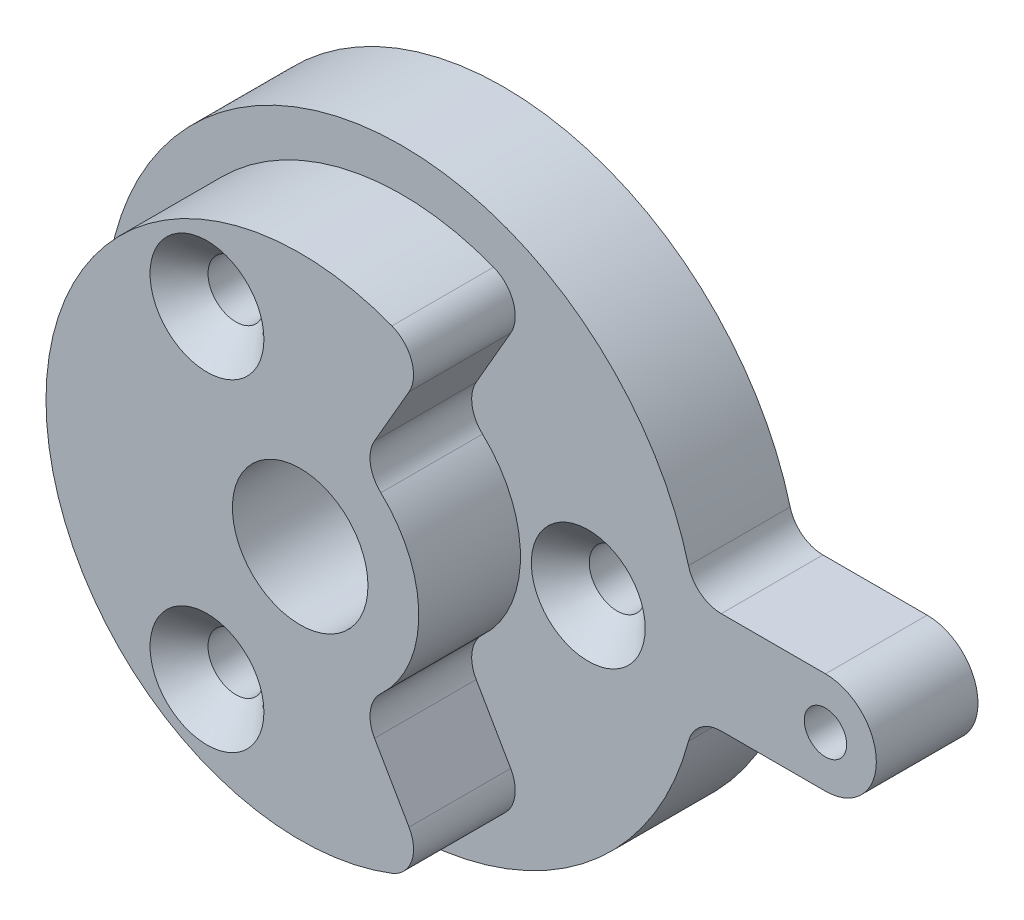
ISO-10303-21;
HEADER;
FILE_DESCRIPTION(('STEP AP214'),'2;1');
FILE_NAME('part.step','',(''),(''),'','','');
FILE_SCHEMA(('AUTOMOTIVE_DESIGN { 1 0 10303 214 1 1 1 1 }'));
ENDSEC;
DATA;
#1=APPLICATION_CONTEXT('core data for automotive mechanical design processes');
#2=APPLICATION_PROTOCOL_DEFINITION('international standard','automotive_design',2000,#1);
#3=PRODUCT_CONTEXT('',#1,'mechanical');
#4=PRODUCT('Part','Part','',(#3));
#5=PRODUCT_RELATED_PRODUCT_CATEGORY('part','',(#4));
#6=PRODUCT_DEFINITION_FORMATION('','',#4);
#7=PRODUCT_DEFINITION_CONTEXT('part definition',#1,'design');
#8=PRODUCT_DEFINITION('design','',#6,#7);
#9=PRODUCT_DEFINITION_SHAPE('','',#8);
#10=(LENGTH_UNIT() NAMED_UNIT(*) SI_UNIT(.MILLI.,.METRE.));
#11=(NAMED_UNIT(*) PLANE_ANGLE_UNIT() SI_UNIT($,.RADIAN.));
#12=(NAMED_UNIT(*) SI_UNIT($,.STERADIAN.) SOLID_ANGLE_UNIT());
#13=UNCERTAINTY_MEASURE_WITH_UNIT(LENGTH_MEASURE(1.E-05),#10,'distance_accuracy_value','');
#14=(GEOMETRIC_REPRESENTATION_CONTEXT(3) GLOBAL_UNCERTAINTY_ASSIGNED_CONTEXT((#13)) GLOBAL_UNIT_ASSIGNED_CONTEXT((#10,
#11,#12)) REPRESENTATION_CONTEXT('',''));
#15=CARTESIAN_POINT('',(0.,0.,0.));
#16=DIRECTION('',(0.,0.,1.));
#17=DIRECTION('',(1.,0.,0.));
#18=AXIS2_PLACEMENT_3D('',#15,#16,#17);
#19=CARTESIAN_POINT('',(0.,0.,12.));
#20=DIRECTION('',(0.,0.,1.));
#21=DIRECTION('',(1.,0.,0.));
#22=AXIS2_PLACEMENT_3D('',#19,#20,#21);
#23=PLANE('',#22);
#24=CARTESIAN_POINT('',(22.,0.,12.));
#25=DIRECTION('',(0.,0.,1.));
#26=DIRECTION('',(1.,0.,0.));
#27=AXIS2_PLACEMENT_3D('',#24,#25,#26);
#28=CIRCLE('',#27,6.72);
#29=CARTESIAN_POINT('',(28.72,0.,12.));
#30=VERTEX_POINT('',#29);
#31=EDGE_CURVE('E554',#30,#30,#28,.T.);
#32=ORIENTED_EDGE('',*,*,#31,.F.);
#33=EDGE_LOOP('',(#32));
#34=FACE_BOUND('',#33,.T.);
#35=CARTESIAN_POINT('',(50.,0.,12.));
#36=DIRECTION('',(0.,0.,1.));
#37=DIRECTION('',(1.,0.,0.));
#38=AXIS2_PLACEMENT_3D('',#35,#36,#37);
#39=CIRCLE('',#38,2.5);
#40=CARTESIAN_POINT('',(52.5,0.,12.));
#41=VERTEX_POINT('',#40);
#42=EDGE_CURVE('E165',#41,#41,#39,.T.);
#43=ORIENTED_EDGE('',*,*,#42,.F.);
#44=EDGE_LOOP('',(#43));
#45=FACE_BOUND('',#44,.T.);
#46=DIRECTION('',(-1.,0.,0.));
#47=VECTOR('',#46,1.);
#48=CARTESIAN_POINT('',(50.,6.,12.));
#49=LINE('',#48,#47);
#50=CARTESIAN_POINT('',(50.,6.,12.));
#51=VERTEX_POINT('',#50);
#52=CARTESIAN_POINT('',(37.6961536499415,6.,12.));
#53=VERTEX_POINT('',#52);
#54=EDGE_CURVE('E152',#51,#53,#49,.T.);
#55=ORIENTED_EDGE('',*,*,#54,.T.);
#56=CARTESIAN_POINT('',(37.6961536499415,10.,12.));
#57=DIRECTION('',(0.,0.,1.));
#58=DIRECTION('',(1.,0.,0.));
#59=AXIS2_PLACEMENT_3D('',#56,#57,#58);
#60=CIRCLE('',#59,4.);
#61=CARTESIAN_POINT('',(33.8298814807168,8.97435897435897,12.));
#62=VERTEX_POINT('',#61);
#63=EDGE_CURVE('E250',#53,#62,#60,.F.);
#64=ORIENTED_EDGE('',*,*,#63,.T.);
#65=CARTESIAN_POINT('',(0.,0.,12.));
#66=DIRECTION('',(0.,0.,1.));
#67=DIRECTION('',(1.,0.,0.));
#68=AXIS2_PLACEMENT_3D('',#65,#66,#67);
#69=CIRCLE('',#68,35.);
#70=CARTESIAN_POINT('',(33.8298814807168,-8.97435897435898,12.));
#71=VERTEX_POINT('',#70);
#72=EDGE_CURVE('E203',#62,#71,#69,.T.);
#73=ORIENTED_EDGE('',*,*,#72,.T.);
#74=CARTESIAN_POINT('',(37.6961536499415,-10.,12.));
#75=DIRECTION('',(0.,0.,1.));
#76=DIRECTION('',(1.,0.,0.));
#77=AXIS2_PLACEMENT_3D('',#74,#75,#76);
#78=CIRCLE('',#77,4.);
#79=CARTESIAN_POINT('',(37.6961536499415,-6.,12.));
#80=VERTEX_POINT('',#79);
#81=EDGE_CURVE('E244',#71,#80,#78,.F.);
#82=ORIENTED_EDGE('',*,*,#81,.T.);
#83=DIRECTION('',(1.,0.,0.));
#84=VECTOR('',#83,1.);
#85=CARTESIAN_POINT('',(50.,-6.,12.));
#86=LINE('',#85,#84);
#87=CARTESIAN_POINT('',(50.,-6.,12.));
#88=VERTEX_POINT('',#87);
#89=EDGE_CURVE('E149',#80,#88,#86,.T.);
#90=ORIENTED_EDGE('',*,*,#89,.T.);
#91=CARTESIAN_POINT('',(50.,0.,12.));
#92=DIRECTION('',(0.,0.,1.));
#93=DIRECTION('',(1.,0.,0.));
#94=AXIS2_PLACEMENT_3D('',#91,#92,#93);
#95=CIRCLE('',#94,6.);
#96=EDGE_CURVE('E144',#88,#51,#95,.T.);
#97=ORIENTED_EDGE('',*,*,#96,.T.);
#98=EDGE_LOOP('',(#55,#64,#73,#82,#90,#97));
#99=FACE_BOUND('',#98,.T.);
#100=CARTESIAN_POINT('',(0.,0.,12.));
#101=DIRECTION('',(0.,0.,1.));
#102=DIRECTION('',(1.,0.,0.));
#103=AXIS2_PLACEMENT_3D('',#100,#101,#102);
#104=CIRCLE('',#103,14.);
#105=CARTESIAN_POINT('',(9.51927355752325,-10.265643230555,12.));
#106=VERTEX_POINT('',#105);
#107=CARTESIAN_POINT('',(9.51927355752325,10.265643230555,12.));
#108=VERTEX_POINT('',#107);
#109=EDGE_CURVE('E178',#106,#108,#104,.T.);
#110=ORIENTED_EDGE('',*,*,#109,.F.);
#111=CARTESIAN_POINT('',(12.2390660025299,-13.1986841535706,12.));
#112=DIRECTION('',(0.,0.,1.));
#113=DIRECTION('',(1.,0.,0.));
#114=AXIS2_PLACEMENT_3D('',#111,#112,#113);
#115=CIRCLE('',#114,4.);
#116=CARTESIAN_POINT('',(8.77496438739214,-15.1986841535707,12.));
#117=VERTEX_POINT('',#116);
#118=EDGE_CURVE('E224',#106,#117,#115,.T.);
#119=ORIENTED_EDGE('',*,*,#118,.T.);
#120=DIRECTION('',(-0.500000000000001,0.866025403784438,0.));
#121=VECTOR('',#120,1.);
#122=CARTESIAN_POINT('',(7.00000000000002,-12.1243556529821,12.));
#123=LINE('',#122,#121);
#124=CARTESIAN_POINT('',(12.8452325786652,-22.248595461287,12.));
#125=VERTEX_POINT('',#124);
#126=EDGE_CURVE('E182',#125,#117,#123,.T.);
#127=ORIENTED_EDGE('',*,*,#126,.F.);
#128=CARTESIAN_POINT('',(9.3811309635274,-24.248595461287,12.));
#129=DIRECTION('',(0.,0.,1.));
#130=DIRECTION('',(1.,0.,0.));
#131=AXIS2_PLACEMENT_3D('',#128,#129,#130);
#132=CIRCLE('',#131,4.);
#133=CARTESIAN_POINT('',(10.8243818809932,-27.9791486091773,12.));
#134=VERTEX_POINT('',#133);
#135=EDGE_CURVE('E254',#125,#134,#132,.F.);
#136=ORIENTED_EDGE('',*,*,#135,.T.);
#137=CARTESIAN_POINT('',(0.,0.,12.));
#138=DIRECTION('',(0.,0.,1.));
#139=DIRECTION('',(1.,0.,0.));
#140=AXIS2_PLACEMENT_3D('',#137,#138,#139);
#141=CIRCLE('',#140,30.);
#142=CARTESIAN_POINT('',(10.8243818809932,27.9791486091773,12.));
#143=VERTEX_POINT('',#142);
#144=EDGE_CURVE('E195',#143,#134,#141,.T.);
#145=ORIENTED_EDGE('',*,*,#144,.F.);
#146=CARTESIAN_POINT('',(9.3811309635274,24.248595461287,12.));
#147=DIRECTION('',(0.,0.,1.));
#148=DIRECTION('',(1.,0.,0.));
#149=AXIS2_PLACEMENT_3D('',#146,#147,#148);
#150=CIRCLE('',#149,4.);
#151=CARTESIAN_POINT('',(12.8452325786652,22.248595461287,12.));
#152=VERTEX_POINT('',#151);
#153=EDGE_CURVE('E45',#143,#152,#150,.F.);
#154=ORIENTED_EDGE('',*,*,#153,.T.);
#155=DIRECTION('',(0.500000000000001,0.866025403784438,0.));
#156=VECTOR('',#155,1.);
#157=CARTESIAN_POINT('',(15.,25.9807621135331,12.));
#158=LINE('',#157,#156);
#159=CARTESIAN_POINT('',(8.77496438739214,15.1986841535707,12.));
#160=VERTEX_POINT('',#159);
#161=EDGE_CURVE('E193',#160,#152,#158,.T.);
#162=ORIENTED_EDGE('',*,*,#161,.F.);
#163=CARTESIAN_POINT('',(12.2390660025299,13.1986841535706,12.));
#164=DIRECTION('',(0.,0.,1.));
#165=DIRECTION('',(1.,0.,0.));
#166=AXIS2_PLACEMENT_3D('',#163,#164,#165);
#167=CIRCLE('',#166,4.);
#168=EDGE_CURVE('E222',#160,#108,#167,.T.);
#169=ORIENTED_EDGE('',*,*,#168,.T.);
#170=EDGE_LOOP('',(#110,#119,#127,#136,#145,#154,#162,#169));
#171=FACE_BOUND('',#170,.T.);
#172=ADVANCED_FACE('F37',(#34,#45,#99,#171),#23,.T.);
#173=CARTESIAN_POINT('',(0.,0.,0.));
#174=DIRECTION('',(0.,0.,1.));
#175=DIRECTION('',(1.,0.,0.));
#176=AXIS2_PLACEMENT_3D('',#173,#174,#175);
#177=PLANE('',#176);
#178=CARTESIAN_POINT('',(-11.,19.0525588832576,0.));
#179=DIRECTION('',(0.,0.,1.));
#180=DIRECTION('',(1.,0.,0.));
#181=AXIS2_PLACEMENT_3D('',#178,#179,#180);
#182=CIRCLE('',#181,3.3);
#183=CARTESIAN_POINT('',(-7.70000000000003,19.0525588832576,0.));
#184=VERTEX_POINT('',#183);
#185=EDGE_CURVE('E566',#184,#184,#182,.T.);
#186=ORIENTED_EDGE('',*,*,#185,.T.);
#187=EDGE_LOOP('',(#186));
#188=FACE_BOUND('',#187,.T.);
#189=CARTESIAN_POINT('',(-11.,-19.0525588832576,0.));
#190=DIRECTION('',(0.,0.,1.));
#191=DIRECTION('',(1.,0.,0.));
#192=AXIS2_PLACEMENT_3D('',#189,#190,#191);
#193=CIRCLE('',#192,3.3);
#194=CARTESIAN_POINT('',(-7.70000000000002,-19.0525588832576,0.));
#195=VERTEX_POINT('',#194);
#196=EDGE_CURVE('E557',#195,#195,#193,.T.);
#197=ORIENTED_EDGE('',*,*,#196,.T.);
#198=EDGE_LOOP('',(#197));
#199=FACE_BOUND('',#198,.T.);
#200=CARTESIAN_POINT('',(22.,0.,0.));
#201=DIRECTION('',(0.,0.,1.));
#202=DIRECTION('',(1.,0.,0.));
#203=AXIS2_PLACEMENT_3D('',#200,#201,#202);
#204=CIRCLE('',#203,3.29999999999999);
#205=CARTESIAN_POINT('',(25.3,0.,0.));
#206=VERTEX_POINT('',#205);
#207=EDGE_CURVE('E548',#206,#206,#204,.T.);
#208=ORIENTED_EDGE('',*,*,#207,.T.);
#209=EDGE_LOOP('',(#208));
#210=FACE_BOUND('',#209,.T.);
#211=CARTESIAN_POINT('',(50.,0.,0.));
#212=DIRECTION('',(0.,0.,1.));
#213=DIRECTION('',(1.,0.,0.));
#214=AXIS2_PLACEMENT_3D('',#211,#212,#213);
#215=CIRCLE('',#214,2.5);
#216=CARTESIAN_POINT('',(52.5,0.,0.));
#217=VERTEX_POINT('',#216);
#218=EDGE_CURVE('E162',#217,#217,#215,.T.);
#219=ORIENTED_EDGE('',*,*,#218,.T.);
#220=EDGE_LOOP('',(#219));
#221=FACE_BOUND('',#220,.T.);
#222=DIRECTION('',(-1.,0.,0.));
#223=VECTOR('',#222,1.);
#224=CARTESIAN_POINT('',(50.,-6.,0.));
#225=LINE('',#224,#223);
#226=CARTESIAN_POINT('',(50.,-6.,0.));
#227=VERTEX_POINT('',#226);
#228=CARTESIAN_POINT('',(37.6961536499415,-6.,0.));
#229=VERTEX_POINT('',#228);
#230=EDGE_CURVE('E171',#227,#229,#225,.T.);
#231=ORIENTED_EDGE('',*,*,#230,.T.);
#232=CARTESIAN_POINT('',(37.6961536499415,-10.,0.));
#233=DIRECTION('',(0.,0.,1.));
#234=DIRECTION('',(1.,0.,0.));
#235=AXIS2_PLACEMENT_3D('',#232,#233,#234);
#236=CIRCLE('',#235,4.);
#237=CARTESIAN_POINT('',(33.8298814807168,-8.97435897435898,0.));
#238=VERTEX_POINT('',#237);
#239=EDGE_CURVE('E246',#229,#238,#236,.T.);
#240=ORIENTED_EDGE('',*,*,#239,.T.);
#241=CARTESIAN_POINT('',(0.,0.,0.));
#242=DIRECTION('',(0.,0.,1.));
#243=DIRECTION('',(1.,0.,0.));
#244=AXIS2_PLACEMENT_3D('',#241,#242,#243);
#245=CIRCLE('',#244,35.);
#246=CARTESIAN_POINT('',(33.8298814807168,8.97435897435897,0.));
#247=VERTEX_POINT('',#246);
#248=EDGE_CURVE('E202',#247,#238,#245,.T.);
#249=ORIENTED_EDGE('',*,*,#248,.F.);
#250=CARTESIAN_POINT('',(37.6961536499415,10.,0.));
#251=DIRECTION('',(0.,0.,1.));
#252=DIRECTION('',(1.,0.,0.));
#253=AXIS2_PLACEMENT_3D('',#250,#251,#252);
#254=CIRCLE('',#253,4.);
#255=CARTESIAN_POINT('',(37.6961536499415,6.,0.));
#256=VERTEX_POINT('',#255);
#257=EDGE_CURVE('E248',#247,#256,#254,.T.);
#258=ORIENTED_EDGE('',*,*,#257,.T.);
#259=DIRECTION('',(1.,0.,0.));
#260=VECTOR('',#259,1.);
#261=CARTESIAN_POINT('',(50.,6.,0.));
#262=LINE('',#261,#260);
#263=CARTESIAN_POINT('',(50.,6.,0.));
#264=VERTEX_POINT('',#263);
#265=EDGE_CURVE('E173',#256,#264,#262,.T.);
#266=ORIENTED_EDGE('',*,*,#265,.T.);
#267=CARTESIAN_POINT('',(50.,0.,0.));
#268=DIRECTION('',(0.,0.,1.));
#269=DIRECTION('',(1.,0.,0.));
#270=AXIS2_PLACEMENT_3D('',#267,#268,#269);
#271=CIRCLE('',#270,6.);
#272=EDGE_CURVE('E145',#264,#227,#271,.F.);
#273=ORIENTED_EDGE('',*,*,#272,.T.);
#274=EDGE_LOOP('',(#231,#240,#249,#258,#266,#273));
#275=FACE_BOUND('',#274,.T.);
#276=CARTESIAN_POINT('',(0.,0.,0.));
#277=DIRECTION('',(0.,0.,1.));
#278=DIRECTION('',(1.,0.,0.));
#279=AXIS2_PLACEMENT_3D('',#276,#277,#278);
#280=CIRCLE('',#279,8.);
#281=CARTESIAN_POINT('',(8.,0.,0.));
#282=VERTEX_POINT('',#281);
#283=EDGE_CURVE('E190',#282,#282,#280,.T.);
#284=ORIENTED_EDGE('',*,*,#283,.T.);
#285=EDGE_LOOP('',(#284));
#286=FACE_BOUND('',#285,.T.);
#287=ADVANCED_FACE('F298',(#188,#199,#210,#221,#275,#286),#177,.F.);
#288=CARTESIAN_POINT('',(0.,0.,12.));
#289=DIRECTION('',(0.,0.,-1.));
#290=DIRECTION('',(-1.,0.,0.));
#291=AXIS2_PLACEMENT_3D('',#288,#289,#290);
#292=CYLINDRICAL_SURFACE('',#291,35.);
#293=ORIENTED_EDGE('',*,*,#248,.T.);
#294=DIRECTION('',(0.,0.,-1.));
#295=VECTOR('',#294,1.);
#296=CARTESIAN_POINT('',(33.8298814807168,-8.97435897435898,12.));
#297=LINE('',#296,#295);
#298=EDGE_CURVE('E211',#238,#71,#297,.F.);
#299=ORIENTED_EDGE('',*,*,#298,.T.);
#300=ORIENTED_EDGE('',*,*,#72,.F.);
#301=DIRECTION('',(0.,0.,-1.));
#302=VECTOR('',#301,1.);
#303=CARTESIAN_POINT('',(33.8298814807168,8.97435897435897,12.));
#304=LINE('',#303,#302);
#305=EDGE_CURVE('E206',#62,#247,#304,.T.);
#306=ORIENTED_EDGE('',*,*,#305,.T.);
#307=EDGE_LOOP('',(#293,#299,#300,#306));
#308=FACE_BOUND('',#307,.T.);
#309=ADVANCED_FACE('F304',(#308),#292,.T.);
#310=CARTESIAN_POINT('',(0.,0.,12.));
#311=DIRECTION('',(0.,0.,-1.));
#312=DIRECTION('',(-1.,0.,0.));
#313=AXIS2_PLACEMENT_3D('',#310,#311,#312);
#314=CYLINDRICAL_SURFACE('',#313,8.);
#315=ORIENTED_EDGE('',*,*,#283,.F.);
#316=EDGE_LOOP('',(#315));
#317=FACE_BOUND('',#316,.T.);
#318=CARTESIAN_POINT('',(0.,0.,24.));
#319=DIRECTION('',(0.,0.,1.));
#320=DIRECTION('',(1.,0.,0.));
#321=AXIS2_PLACEMENT_3D('',#318,#319,#320);
#322=CIRCLE('',#321,8.);
#323=CARTESIAN_POINT('',(8.,0.,24.));
#324=VERTEX_POINT('',#323);
#325=EDGE_CURVE('E175',#324,#324,#322,.T.);
#326=ORIENTED_EDGE('',*,*,#325,.T.);
#327=EDGE_LOOP('',(#326));
#328=FACE_BOUND('',#327,.T.);
#329=ADVANCED_FACE('F310',(#317,#328),#314,.F.);
#330=CARTESIAN_POINT('',(0.,0.,24.));
#331=DIRECTION('',(0.,0.,1.));
#332=DIRECTION('',(1.,0.,0.));
#333=AXIS2_PLACEMENT_3D('',#330,#331,#332);
#334=PLANE('',#333);
#335=CARTESIAN_POINT('',(-11.,19.0525588832576,24.));
#336=DIRECTION('',(0.,0.,1.));
#337=DIRECTION('',(1.,0.,0.));
#338=AXIS2_PLACEMENT_3D('',#335,#336,#337);
#339=CIRCLE('',#338,6.72);
#340=CARTESIAN_POINT('',(-4.28000000000002,19.0525588832576,24.));
#341=VERTEX_POINT('',#340);
#342=EDGE_CURVE('E572',#341,#341,#339,.T.);
#343=ORIENTED_EDGE('',*,*,#342,.F.);
#344=EDGE_LOOP('',(#343));
#345=FACE_BOUND('',#344,.T.);
#346=CARTESIAN_POINT('',(-11.,-19.0525588832576,24.));
#347=DIRECTION('',(0.,0.,1.));
#348=DIRECTION('',(1.,0.,0.));
#349=AXIS2_PLACEMENT_3D('',#346,#347,#348);
#350=CIRCLE('',#349,6.72);
#351=CARTESIAN_POINT('',(-4.28000000000001,-19.0525588832576,24.));
#352=VERTEX_POINT('',#351);
#353=EDGE_CURVE('E563',#352,#352,#350,.T.);
#354=ORIENTED_EDGE('',*,*,#353,.F.);
#355=EDGE_LOOP('',(#354));
#356=FACE_BOUND('',#355,.T.);
#357=CARTESIAN_POINT('',(0.,0.,24.));
#358=DIRECTION('',(0.,0.,1.));
#359=DIRECTION('',(1.,0.,0.));
#360=AXIS2_PLACEMENT_3D('',#357,#358,#359);
#361=CIRCLE('',#360,30.);
#362=CARTESIAN_POINT('',(10.8243818809932,27.9791486091773,24.));
#363=VERTEX_POINT('',#362);
#364=CARTESIAN_POINT('',(10.8243818809932,-27.9791486091773,24.));
#365=VERTEX_POINT('',#364);
#366=EDGE_CURVE('E184',#363,#365,#361,.T.);
#367=ORIENTED_EDGE('',*,*,#366,.T.);
#368=CARTESIAN_POINT('',(9.3811309635274,-24.248595461287,24.));
#369=DIRECTION('',(0.,0.,1.));
#370=DIRECTION('',(1.,0.,0.));
#371=AXIS2_PLACEMENT_3D('',#368,#369,#370);
#372=CIRCLE('',#371,4.);
#373=CARTESIAN_POINT('',(12.8452325786652,-22.248595461287,24.));
#374=VERTEX_POINT('',#373);
#375=EDGE_CURVE('E238',#365,#374,#372,.T.);
#376=ORIENTED_EDGE('',*,*,#375,.T.);
#377=DIRECTION('',(-0.500000000000001,0.866025403784438,0.));
#378=VECTOR('',#377,1.);
#379=CARTESIAN_POINT('',(7.00000000000002,-12.1243556529821,24.));
#380=LINE('',#379,#378);
#381=CARTESIAN_POINT('',(8.77496438739214,-15.1986841535707,24.));
#382=VERTEX_POINT('',#381);
#383=EDGE_CURVE('E187',#374,#382,#380,.T.);
#384=ORIENTED_EDGE('',*,*,#383,.T.);
#385=CARTESIAN_POINT('',(12.2390660025299,-13.1986841535706,24.));
#386=DIRECTION('',(0.,0.,1.));
#387=DIRECTION('',(1.,0.,0.));
#388=AXIS2_PLACEMENT_3D('',#385,#386,#387);
#389=CIRCLE('',#388,4.);
#390=CARTESIAN_POINT('',(9.51927355752325,-10.265643230555,24.));
#391=VERTEX_POINT('',#390);
#392=EDGE_CURVE('E252',#382,#391,#389,.F.);
#393=ORIENTED_EDGE('',*,*,#392,.T.);
#394=CARTESIAN_POINT('',(0.,0.,24.));
#395=DIRECTION('',(0.,0.,1.));
#396=DIRECTION('',(1.,0.,0.));
#397=AXIS2_PLACEMENT_3D('',#394,#395,#396);
#398=CIRCLE('',#397,14.);
#399=CARTESIAN_POINT('',(9.51927355752325,10.265643230555,24.));
#400=VERTEX_POINT('',#399);
#401=EDGE_CURVE('E179',#391,#400,#398,.T.);
#402=ORIENTED_EDGE('',*,*,#401,.T.);
#403=CARTESIAN_POINT('',(12.2390660025299,13.1986841535706,24.));
#404=DIRECTION('',(0.,0.,1.));
#405=DIRECTION('',(1.,0.,0.));
#406=AXIS2_PLACEMENT_3D('',#403,#404,#405);
#407=CIRCLE('',#406,4.);
#408=CARTESIAN_POINT('',(8.77496438739214,15.1986841535707,24.));
#409=VERTEX_POINT('',#408);
#410=EDGE_CURVE('E11',#400,#409,#407,.F.);
#411=ORIENTED_EDGE('',*,*,#410,.T.);
#412=DIRECTION('',(0.500000000000001,0.866025403784438,0.));
#413=VECTOR('',#412,1.);
#414=CARTESIAN_POINT('',(15.,25.9807621135331,24.));
#415=LINE('',#414,#413);
#416=CARTESIAN_POINT('',(12.8452325786652,22.248595461287,24.));
#417=VERTEX_POINT('',#416);
#418=EDGE_CURVE('E181',#409,#417,#415,.T.);
#419=ORIENTED_EDGE('',*,*,#418,.T.);
#420=CARTESIAN_POINT('',(9.3811309635274,24.248595461287,24.));
#421=DIRECTION('',(0.,0.,1.));
#422=DIRECTION('',(1.,0.,0.));
#423=AXIS2_PLACEMENT_3D('',#420,#421,#422);
#424=CIRCLE('',#423,4.);
#425=EDGE_CURVE('E236',#417,#363,#424,.T.);
#426=ORIENTED_EDGE('',*,*,#425,.T.);
#427=EDGE_LOOP('',(#367,#376,#384,#393,#402,#411,#419,#426));
#428=FACE_BOUND('',#427,.T.);
#429=ORIENTED_EDGE('',*,*,#325,.F.);
#430=EDGE_LOOP('',(#429));
#431=FACE_BOUND('',#430,.T.);
#432=ADVANCED_FACE('F265',(#345,#356,#428,#431),#334,.T.);
#433=CARTESIAN_POINT('',(0.,0.,24.));
#434=DIRECTION('',(0.,0.,-1.));
#435=DIRECTION('',(-1.,0.,0.));
#436=AXIS2_PLACEMENT_3D('',#433,#434,#435);
#437=CYLINDRICAL_SURFACE('',#436,14.);
#438=ORIENTED_EDGE('',*,*,#401,.F.);
#439=DIRECTION('',(0.,0.,-1.));
#440=VECTOR('',#439,1.);
#441=CARTESIAN_POINT('',(9.51927355752325,-10.265643230555,24.));
#442=LINE('',#441,#440);
#443=EDGE_CURVE('E219',#391,#106,#442,.T.);
#444=ORIENTED_EDGE('',*,*,#443,.T.);
#445=ORIENTED_EDGE('',*,*,#109,.T.);
#446=DIRECTION('',(0.,0.,-1.));
#447=VECTOR('',#446,1.);
#448=CARTESIAN_POINT('',(9.51927355752325,10.265643230555,24.));
#449=LINE('',#448,#447);
#450=EDGE_CURVE('E217',#108,#400,#449,.F.);
#451=ORIENTED_EDGE('',*,*,#450,.T.);
#452=EDGE_LOOP('',(#438,#444,#445,#451));
#453=FACE_BOUND('',#452,.T.);
#454=ADVANCED_FACE('F285',(#453),#437,.T.);
#455=CARTESIAN_POINT('',(15.,25.9807621135331,24.));
#456=DIRECTION('',(-0.866025403784438,0.500000000000001,0.));
#457=DIRECTION('',(-0.500000000000001,-0.866025403784438,0.));
#458=AXIS2_PLACEMENT_3D('',#455,#456,#457);
#459=PLANE('',#458);
#460=ORIENTED_EDGE('',*,*,#161,.T.);
#461=DIRECTION('',(0.,0.,-1.));
#462=VECTOR('',#461,1.);
#463=CARTESIAN_POINT('',(12.8452325786652,22.248595461287,24.));
#464=LINE('',#463,#462);
#465=EDGE_CURVE('E52',#152,#417,#464,.F.);
#466=ORIENTED_EDGE('',*,*,#465,.T.);
#467=ORIENTED_EDGE('',*,*,#418,.F.);
#468=DIRECTION('',(0.,0.,1.));
#469=VECTOR('',#468,1.);
#470=CARTESIAN_POINT('',(8.77496438739214,15.1986841535707,12.));
#471=LINE('',#470,#469);
#472=EDGE_CURVE('E240',#409,#160,#471,.F.);
#473=ORIENTED_EDGE('',*,*,#472,.T.);
#474=EDGE_LOOP('',(#460,#466,#467,#473));
#475=FACE_BOUND('',#474,.T.);
#476=ADVANCED_FACE('F260',(#475),#459,.F.);
#477=CARTESIAN_POINT('',(0.,0.,24.));
#478=DIRECTION('',(0.,0.,-1.));
#479=DIRECTION('',(-1.,0.,0.));
#480=AXIS2_PLACEMENT_3D('',#477,#478,#479);
#481=CYLINDRICAL_SURFACE('',#480,30.);
#482=ORIENTED_EDGE('',*,*,#144,.T.);
#483=DIRECTION('',(0.,0.,-1.));
#484=VECTOR('',#483,1.);
#485=CARTESIAN_POINT('',(10.8243818809932,-27.9791486091773,24.));
#486=LINE('',#485,#484);
#487=EDGE_CURVE('E234',#134,#365,#486,.F.);
#488=ORIENTED_EDGE('',*,*,#487,.T.);
#489=ORIENTED_EDGE('',*,*,#366,.F.);
#490=DIRECTION('',(0.,0.,-1.));
#491=VECTOR('',#490,1.);
#492=CARTESIAN_POINT('',(10.8243818809932,27.9791486091773,24.));
#493=LINE('',#492,#491);
#494=EDGE_CURVE('E231',#363,#143,#493,.T.);
#495=ORIENTED_EDGE('',*,*,#494,.T.);
#496=EDGE_LOOP('',(#482,#488,#489,#495));
#497=FACE_BOUND('',#496,.T.);
#498=ADVANCED_FACE('F269',(#497),#481,.T.);
#499=CARTESIAN_POINT('',(7.00000000000002,-12.1243556529821,24.));
#500=DIRECTION('',(-0.866025403784438,-0.500000000000001,0.));
#501=DIRECTION('',(0.500000000000001,-0.866025403784438,0.));
#502=AXIS2_PLACEMENT_3D('',#499,#500,#501);
#503=PLANE('',#502);
#504=ORIENTED_EDGE('',*,*,#126,.T.);
#505=DIRECTION('',(0.,0.,1.));
#506=VECTOR('',#505,1.);
#507=CARTESIAN_POINT('',(8.77496438739214,-15.1986841535707,24.));
#508=LINE('',#507,#506);
#509=EDGE_CURVE('E229',#117,#382,#508,.T.);
#510=ORIENTED_EDGE('',*,*,#509,.T.);
#511=ORIENTED_EDGE('',*,*,#383,.F.);
#512=DIRECTION('',(0.,0.,-1.));
#513=VECTOR('',#512,1.);
#514=CARTESIAN_POINT('',(12.8452325786652,-22.248595461287,24.));
#515=LINE('',#514,#513);
#516=EDGE_CURVE('E226',#374,#125,#515,.T.);
#517=ORIENTED_EDGE('',*,*,#516,.T.);
#518=EDGE_LOOP('',(#504,#510,#511,#517));
#519=FACE_BOUND('',#518,.T.);
#520=ADVANCED_FACE('F277',(#519),#503,.F.);
#521=CARTESIAN_POINT('',(50.,-6.,-49.4772675074119));
#522=DIRECTION('',(0.,-1.,0.));
#523=DIRECTION('',(1.,0.,0.));
#524=AXIS2_PLACEMENT_3D('',#521,#522,#523);
#525=PLANE('',#524);
#526=ORIENTED_EDGE('',*,*,#89,.F.);
#527=DIRECTION('',(0.,0.,-1.));
#528=VECTOR('',#527,1.);
#529=CARTESIAN_POINT('',(37.6961536499415,-6.,-49.4772675074119));
#530=LINE('',#529,#528);
#531=EDGE_CURVE('E214',#80,#229,#530,.T.);
#532=ORIENTED_EDGE('',*,*,#531,.T.);
#533=ORIENTED_EDGE('',*,*,#230,.F.);
#534=DIRECTION('',(0.,0.,1.));
#535=VECTOR('',#534,1.);
#536=CARTESIAN_POINT('',(50.,-6.,-49.4772675074119));
#537=LINE('',#536,#535);
#538=EDGE_CURVE('E148',#227,#88,#537,.T.);
#539=ORIENTED_EDGE('',*,*,#538,.T.);
#540=EDGE_LOOP('',(#526,#532,#533,#539));
#541=FACE_BOUND('',#540,.T.);
#542=ADVANCED_FACE('F439',(#541),#525,.T.);
#543=CARTESIAN_POINT('',(50.,6.,-49.4772675074119));
#544=DIRECTION('',(0.,1.,0.));
#545=DIRECTION('',(-1.,0.,0.));
#546=AXIS2_PLACEMENT_3D('',#543,#544,#545);
#547=PLANE('',#546);
#548=ORIENTED_EDGE('',*,*,#265,.F.);
#549=DIRECTION('',(0.,0.,-1.));
#550=VECTOR('',#549,1.);
#551=CARTESIAN_POINT('',(37.6961536499415,6.,-49.4772675074119));
#552=LINE('',#551,#550);
#553=EDGE_CURVE('E155',#256,#53,#552,.F.);
#554=ORIENTED_EDGE('',*,*,#553,.T.);
#555=ORIENTED_EDGE('',*,*,#54,.F.);
#556=DIRECTION('',(0.,0.,1.));
#557=VECTOR('',#556,1.);
#558=CARTESIAN_POINT('',(50.,6.,-49.4772675074119));
#559=LINE('',#558,#557);
#560=EDGE_CURVE('E139',#264,#51,#559,.T.);
#561=ORIENTED_EDGE('',*,*,#560,.F.);
#562=EDGE_LOOP('',(#548,#554,#555,#561));
#563=FACE_BOUND('',#562,.T.);
#564=ADVANCED_FACE('F153',(#563),#547,.T.);
#565=CARTESIAN_POINT('',(50.,0.,-49.4772675074119));
#566=DIRECTION('',(0.,0.,1.));
#567=DIRECTION('',(1.,0.,0.));
#568=AXIS2_PLACEMENT_3D('',#565,#566,#567);
#569=CYLINDRICAL_SURFACE('',#568,6.);
#570=ORIENTED_EDGE('',*,*,#272,.F.);
#571=ORIENTED_EDGE('',*,*,#560,.T.);
#572=ORIENTED_EDGE('',*,*,#96,.F.);
#573=ORIENTED_EDGE('',*,*,#538,.F.);
#574=EDGE_LOOP('',(#570,#571,#572,#573));
#575=FACE_BOUND('',#574,.T.);
#576=ADVANCED_FACE('F141',(#575),#569,.T.);
#577=CARTESIAN_POINT('',(37.6961536499415,-10.,12.));
#578=DIRECTION('',(0.,0.,-1.));
#579=DIRECTION('',(-1.,0.,0.));
#580=AXIS2_PLACEMENT_3D('',#577,#578,#579);
#581=CYLINDRICAL_SURFACE('',#580,4.);
#582=ORIENTED_EDGE('',*,*,#239,.F.);
#583=ORIENTED_EDGE('',*,*,#531,.F.);
#584=ORIENTED_EDGE('',*,*,#81,.F.);
#585=ORIENTED_EDGE('',*,*,#298,.F.);
#586=EDGE_LOOP('',(#582,#583,#584,#585));
#587=FACE_BOUND('',#586,.T.);
#588=ADVANCED_FACE('F316',(#587),#581,.F.);
#589=CARTESIAN_POINT('',(37.6961536499415,10.,12.));
#590=DIRECTION('',(0.,0.,-1.));
#591=DIRECTION('',(-1.,0.,0.));
#592=AXIS2_PLACEMENT_3D('',#589,#590,#591);
#593=CYLINDRICAL_SURFACE('',#592,4.);
#594=ORIENTED_EDGE('',*,*,#63,.F.);
#595=ORIENTED_EDGE('',*,*,#553,.F.);
#596=ORIENTED_EDGE('',*,*,#257,.F.);
#597=ORIENTED_EDGE('',*,*,#305,.F.);
#598=EDGE_LOOP('',(#594,#595,#596,#597));
#599=FACE_BOUND('',#598,.T.);
#600=ADVANCED_FACE('F319',(#599),#593,.F.);
#601=CARTESIAN_POINT('',(12.2390660025299,-13.1986841535706,24.));
#602=DIRECTION('',(0.,0.,-1.));
#603=DIRECTION('',(-1.,0.,0.));
#604=AXIS2_PLACEMENT_3D('',#601,#602,#603);
#605=CYLINDRICAL_SURFACE('',#604,4.);
#606=ORIENTED_EDGE('',*,*,#392,.F.);
#607=ORIENTED_EDGE('',*,*,#509,.F.);
#608=ORIENTED_EDGE('',*,*,#118,.F.);
#609=ORIENTED_EDGE('',*,*,#443,.F.);
#610=EDGE_LOOP('',(#606,#607,#608,#609));
#611=FACE_BOUND('',#610,.T.);
#612=ADVANCED_FACE('F281',(#611),#605,.F.);
#613=CARTESIAN_POINT('',(9.3811309635274,-24.248595461287,24.));
#614=DIRECTION('',(0.,0.,-1.));
#615=DIRECTION('',(-1.,0.,0.));
#616=AXIS2_PLACEMENT_3D('',#613,#614,#615);
#617=CYLINDRICAL_SURFACE('',#616,4.);
#618=ORIENTED_EDGE('',*,*,#375,.F.);
#619=ORIENTED_EDGE('',*,*,#487,.F.);
#620=ORIENTED_EDGE('',*,*,#135,.F.);
#621=ORIENTED_EDGE('',*,*,#516,.F.);
#622=EDGE_LOOP('',(#618,#619,#620,#621));
#623=FACE_BOUND('',#622,.T.);
#624=ADVANCED_FACE('F272',(#623),#617,.T.);
#625=CARTESIAN_POINT('',(9.3811309635274,24.248595461287,24.));
#626=DIRECTION('',(0.,0.,-1.));
#627=DIRECTION('',(-1.,0.,0.));
#628=AXIS2_PLACEMENT_3D('',#625,#626,#627);
#629=CYLINDRICAL_SURFACE('',#628,4.);
#630=ORIENTED_EDGE('',*,*,#425,.F.);
#631=ORIENTED_EDGE('',*,*,#465,.F.);
#632=ORIENTED_EDGE('',*,*,#153,.F.);
#633=ORIENTED_EDGE('',*,*,#494,.F.);
#634=EDGE_LOOP('',(#630,#631,#632,#633));
#635=FACE_BOUND('',#634,.T.);
#636=ADVANCED_FACE('F263',(#635),#629,.T.);
#637=CARTESIAN_POINT('',(12.2390660025299,13.1986841535706,24.));
#638=DIRECTION('',(0.,0.,-1.));
#639=DIRECTION('',(-1.,0.,0.));
#640=AXIS2_PLACEMENT_3D('',#637,#638,#639);
#641=CYLINDRICAL_SURFACE('',#640,4.);
#642=ORIENTED_EDGE('',*,*,#410,.F.);
#643=ORIENTED_EDGE('',*,*,#450,.F.);
#644=ORIENTED_EDGE('',*,*,#168,.F.);
#645=ORIENTED_EDGE('',*,*,#472,.F.);
#646=EDGE_LOOP('',(#642,#643,#644,#645));
#647=FACE_BOUND('',#646,.T.);
#648=ADVANCED_FACE('F39',(#647),#641,.F.);
#649=CARTESIAN_POINT('',(50.,0.,12.));
#650=DIRECTION('',(0.,0.,1.));
#651=DIRECTION('',(1.,0.,0.));
#652=AXIS2_PLACEMENT_3D('',#649,#650,#651);
#653=CYLINDRICAL_SURFACE('',#652,2.5);
#654=ORIENTED_EDGE('',*,*,#218,.F.);
#655=EDGE_LOOP('',(#654));
#656=FACE_BOUND('',#655,.T.);
#657=ORIENTED_EDGE('',*,*,#42,.T.);
#658=EDGE_LOOP('',(#657));
#659=FACE_BOUND('',#658,.T.);
#660=ADVANCED_FACE('F289',(#656,#659),#653,.F.);
#661=CARTESIAN_POINT('',(22.,0.,12.));
#662=DIRECTION('',(0.,0.,1.));
#663=DIRECTION('',(1.,0.,0.));
#664=AXIS2_PLACEMENT_3D('',#661,#662,#663);
#665=CYLINDRICAL_SURFACE('',#664,3.3);
#666=ORIENTED_EDGE('',*,*,#207,.F.);
#667=EDGE_LOOP('',(#666));
#668=FACE_BOUND('',#667,.T.);
#669=CARTESIAN_POINT('',(22.,0.,8.58));
#670=DIRECTION('',(0.,0.,1.));
#671=DIRECTION('',(1.,0.,0.));
#672=AXIS2_PLACEMENT_3D('',#669,#670,#671);
#673=CIRCLE('',#672,3.3);
#674=CARTESIAN_POINT('',(25.3,0.,8.58));
#675=VERTEX_POINT('',#674);
#676=EDGE_CURVE('E551',#675,#675,#673,.T.);
#677=ORIENTED_EDGE('',*,*,#676,.T.);
#678=EDGE_LOOP('',(#677));
#679=FACE_BOUND('',#678,.T.);
#680=ADVANCED_FACE('F294',(#668,#679),#665,.F.);
#681=CARTESIAN_POINT('',(22.,0.,12.));
#682=DIRECTION('',(0.,0.,1.));
#683=DIRECTION('',(1.,0.,0.));
#684=AXIS2_PLACEMENT_3D('',#681,#682,#683);
#685=CONICAL_SURFACE('',#684,6.72,0.785398163397449);
#686=ORIENTED_EDGE('',*,*,#676,.F.);
#687=EDGE_LOOP('',(#686));
#688=FACE_BOUND('',#687,.T.);
#689=ORIENTED_EDGE('',*,*,#31,.T.);
#690=EDGE_LOOP('',(#689));
#691=FACE_BOUND('',#690,.T.);
#692=ADVANCED_FACE('F382',(#688,#691),#685,.F.);
#693=CARTESIAN_POINT('',(-11.,-19.0525588832576,24.));
#694=DIRECTION('',(0.,0.,1.));
#695=DIRECTION('',(1.,0.,0.));
#696=AXIS2_PLACEMENT_3D('',#693,#694,#695);
#697=CYLINDRICAL_SURFACE('',#696,3.3);
#698=ORIENTED_EDGE('',*,*,#196,.F.);
#699=EDGE_LOOP('',(#698));
#700=FACE_BOUND('',#699,.T.);
#701=CARTESIAN_POINT('',(-11.,-19.0525588832576,20.58));
#702=DIRECTION('',(0.,0.,1.));
#703=DIRECTION('',(1.,0.,0.));
#704=AXIS2_PLACEMENT_3D('',#701,#702,#703);
#705=CIRCLE('',#704,3.3);
#706=CARTESIAN_POINT('',(-7.70000000000001,-19.0525588832576,20.58));
#707=VERTEX_POINT('',#706);
#708=EDGE_CURVE('E560',#707,#707,#705,.T.);
#709=ORIENTED_EDGE('',*,*,#708,.T.);
#710=EDGE_LOOP('',(#709));
#711=FACE_BOUND('',#710,.T.);
#712=ADVANCED_FACE('F392',(#700,#711),#697,.F.);
#713=CARTESIAN_POINT('',(-11.,-19.0525588832576,24.));
#714=DIRECTION('',(0.,0.,1.));
#715=DIRECTION('',(1.,0.,0.));
#716=AXIS2_PLACEMENT_3D('',#713,#714,#715);
#717=CONICAL_SURFACE('',#716,6.72,0.785398163397449);
#718=ORIENTED_EDGE('',*,*,#708,.F.);
#719=EDGE_LOOP('',(#718));
#720=FACE_BOUND('',#719,.T.);
#721=ORIENTED_EDGE('',*,*,#353,.T.);
#722=EDGE_LOOP('',(#721));
#723=FACE_BOUND('',#722,.T.);
#724=ADVANCED_FACE('F402',(#720,#723),#717,.F.);
#725=CARTESIAN_POINT('',(-11.,19.0525588832576,24.));
#726=DIRECTION('',(0.,0.,1.));
#727=DIRECTION('',(1.,0.,0.));
#728=AXIS2_PLACEMENT_3D('',#725,#726,#727);
#729=CYLINDRICAL_SURFACE('',#728,3.3);
#730=ORIENTED_EDGE('',*,*,#185,.F.);
#731=EDGE_LOOP('',(#730));
#732=FACE_BOUND('',#731,.T.);
#733=CARTESIAN_POINT('',(-11.,19.0525588832576,20.58));
#734=DIRECTION('',(0.,0.,1.));
#735=DIRECTION('',(1.,0.,0.));
#736=AXIS2_PLACEMENT_3D('',#733,#734,#735);
#737=CIRCLE('',#736,3.3);
#738=CARTESIAN_POINT('',(-7.70000000000003,19.0525588832576,20.58));
#739=VERTEX_POINT('',#738);
#740=EDGE_CURVE('E569',#739,#739,#737,.T.);
#741=ORIENTED_EDGE('',*,*,#740,.T.);
#742=EDGE_LOOP('',(#741));
#743=FACE_BOUND('',#742,.T.);
#744=ADVANCED_FACE('F412',(#732,#743),#729,.F.);
#745=CARTESIAN_POINT('',(-11.,19.0525588832576,24.));
#746=DIRECTION('',(0.,0.,1.));
#747=DIRECTION('',(1.,0.,0.));
#748=AXIS2_PLACEMENT_3D('',#745,#746,#747);
#749=CONICAL_SURFACE('',#748,6.72,0.785398163397449);
#750=ORIENTED_EDGE('',*,*,#740,.F.);
#751=EDGE_LOOP('',(#750));
#752=FACE_BOUND('',#751,.T.);
#753=ORIENTED_EDGE('',*,*,#342,.T.);
#754=EDGE_LOOP('',(#753));
#755=FACE_BOUND('',#754,.T.);
#756=ADVANCED_FACE('F422',(#752,#755),#749,.F.);
#757=CLOSED_SHELL('',(#172,#287,#309,#329,#432,#454,#476,#498,#520,#542,#564,#576,#588,#600,
#612,#624,#636,#648,#660,#680,#692,#712,#724,#744,#756));
#758=MANIFOLD_SOLID_BREP('B2',#757);
#759=ADVANCED_BREP_SHAPE_REPRESENTATION('',(#18,#758),#14);
#760=SHAPE_DEFINITION_REPRESENTATION(#9,#759);
ENDSEC;
END-ISO-10303-21;
